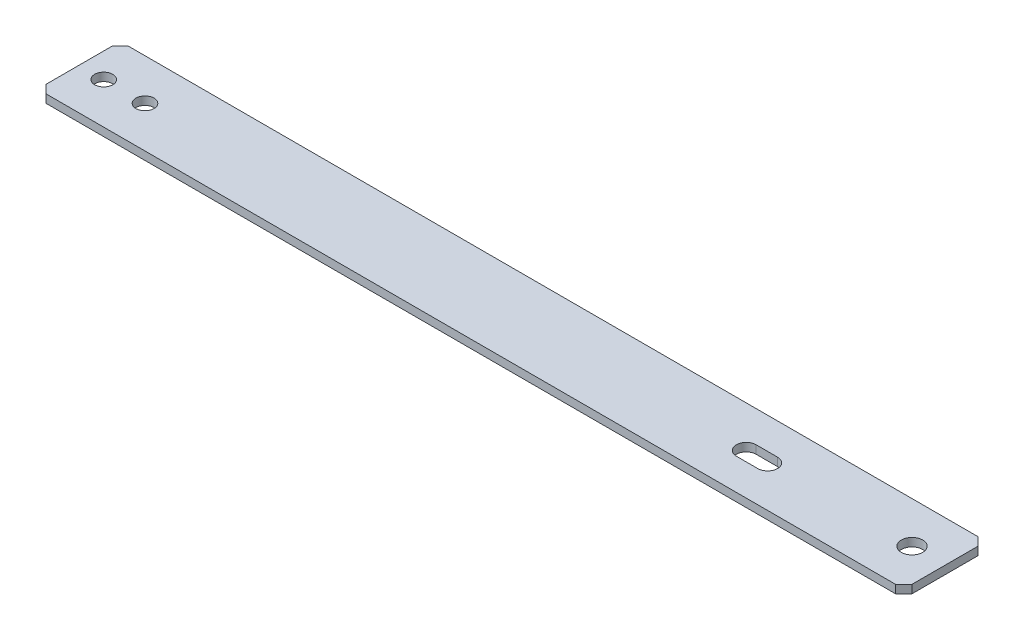
ISO-10303-21;
HEADER;
FILE_DESCRIPTION(('STEP AP214'),'2;1');
FILE_NAME('part.step','',(''),(''),'','','');
FILE_SCHEMA(('AUTOMOTIVE_DESIGN { 1 0 10303 214 1 1 1 1 }'));
ENDSEC;
DATA;
#1=APPLICATION_CONTEXT('core data for automotive mechanical design processes');
#2=APPLICATION_PROTOCOL_DEFINITION('international standard','automotive_design',2000,#1);
#3=PRODUCT_CONTEXT('',#1,'mechanical');
#4=PRODUCT('Part','Part','',(#3));
#5=PRODUCT_RELATED_PRODUCT_CATEGORY('part','',(#4));
#6=PRODUCT_DEFINITION_FORMATION('','',#4);
#7=PRODUCT_DEFINITION_CONTEXT('part definition',#1,'design');
#8=PRODUCT_DEFINITION('design','',#6,#7);
#9=PRODUCT_DEFINITION_SHAPE('','',#8);
#10=(LENGTH_UNIT() NAMED_UNIT(*) SI_UNIT(.MILLI.,.METRE.));
#11=(NAMED_UNIT(*) PLANE_ANGLE_UNIT() SI_UNIT($,.RADIAN.));
#12=(NAMED_UNIT(*) SI_UNIT($,.STERADIAN.) SOLID_ANGLE_UNIT());
#13=UNCERTAINTY_MEASURE_WITH_UNIT(LENGTH_MEASURE(1.E-05),#10,'distance_accuracy_value','');
#14=(GEOMETRIC_REPRESENTATION_CONTEXT(3) GLOBAL_UNCERTAINTY_ASSIGNED_CONTEXT((#13)) GLOBAL_UNIT_ASSIGNED_CONTEXT((#10,
#11,#12)) REPRESENTATION_CONTEXT('',''));
#15=CARTESIAN_POINT('',(0.,0.,0.));
#16=DIRECTION('',(0.,0.,1.));
#17=DIRECTION('',(1.,0.,0.));
#18=AXIS2_PLACEMENT_3D('',#15,#16,#17);
#19=CARTESIAN_POINT('',(-206.818181818182,-5.,50.));
#20=DIRECTION('',(0.,1.,0.));
#21=DIRECTION('',(0.,0.,1.));
#22=AXIS2_PLACEMENT_3D('',#19,#20,#21);
#23=PLANE('',#22);
#24=CARTESIAN_POINT('',(298.181818181818,-5.,25.));
#25=DIRECTION('',(0.,1.,0.));
#26=DIRECTION('',(0.,0.,1.));
#27=AXIS2_PLACEMENT_3D('',#24,#25,#26);
#28=CIRCLE('',#27,6.50000000000002);
#29=CARTESIAN_POINT('',(298.181818181818,-5.,31.5));
#30=VERTEX_POINT('',#29);
#31=EDGE_CURVE('E332',#30,#30,#28,.T.);
#32=ORIENTED_EDGE('',*,*,#31,.T.);
#33=EDGE_LOOP('',(#32));
#34=FACE_BOUND('',#33,.T.);
#35=DIRECTION('',(-1.,0.,0.));
#36=VECTOR('',#35,1.);
#37=CARTESIAN_POINT('',(-206.818181818182,-5.,19.0000000000001));
#38=LINE('',#37,#36);
#39=CARTESIAN_POINT('',(210.681818181818,-5.,19.));
#40=VERTEX_POINT('',#39);
#41=CARTESIAN_POINT('',(197.681818181818,-5.,19.));
#42=VERTEX_POINT('',#41);
#43=EDGE_CURVE('E170',#40,#42,#38,.T.);
#44=ORIENTED_EDGE('',*,*,#43,.T.);
#45=CARTESIAN_POINT('',(197.681818181818,-5.,25.));
#46=DIRECTION('',(0.,1.,0.));
#47=DIRECTION('',(0.,0.,1.));
#48=AXIS2_PLACEMENT_3D('',#45,#46,#47);
#49=CIRCLE('',#48,6.);
#50=CARTESIAN_POINT('',(197.681818181818,-5.,31.));
#51=VERTEX_POINT('',#50);
#52=EDGE_CURVE('E173',#42,#51,#49,.T.);
#53=ORIENTED_EDGE('',*,*,#52,.T.);
#54=DIRECTION('',(1.,0.,0.));
#55=VECTOR('',#54,1.);
#56=CARTESIAN_POINT('',(-206.818181818182,-5.,31.0000000000001));
#57=LINE('',#56,#55);
#58=CARTESIAN_POINT('',(210.681818181818,-5.,31.));
#59=VERTEX_POINT('',#58);
#60=EDGE_CURVE('E165',#51,#59,#57,.T.);
#61=ORIENTED_EDGE('',*,*,#60,.T.);
#62=CARTESIAN_POINT('',(210.681818181818,-5.,25.));
#63=DIRECTION('',(0.,1.,0.));
#64=DIRECTION('',(0.,0.,1.));
#65=AXIS2_PLACEMENT_3D('',#62,#63,#64);
#66=CIRCLE('',#65,6.);
#67=EDGE_CURVE('E140',#59,#40,#66,.T.);
#68=ORIENTED_EDGE('',*,*,#67,.T.);
#69=EDGE_LOOP('',(#44,#53,#61,#68));
#70=FACE_BOUND('',#69,.T.);
#71=CARTESIAN_POINT('',(-191.818181818182,-5.,25.));
#72=DIRECTION('',(0.,1.,0.));
#73=DIRECTION('',(0.,0.,1.));
#74=AXIS2_PLACEMENT_3D('',#71,#72,#73);
#75=CIRCLE('',#74,5.50000000000002);
#76=CARTESIAN_POINT('',(-191.818181818182,-5.,30.5));
#77=VERTEX_POINT('',#76);
#78=EDGE_CURVE('E185',#77,#77,#75,.T.);
#79=ORIENTED_EDGE('',*,*,#78,.T.);
#80=EDGE_LOOP('',(#79));
#81=FACE_BOUND('',#80,.T.);
#82=CARTESIAN_POINT('',(-166.818181818182,-5.,25.));
#83=DIRECTION('',(0.,1.,0.));
#84=DIRECTION('',(0.,0.,1.));
#85=AXIS2_PLACEMENT_3D('',#82,#83,#84);
#86=CIRCLE('',#85,5.50000000000002);
#87=CARTESIAN_POINT('',(-166.818181818182,-5.,30.5));
#88=VERTEX_POINT('',#87);
#89=EDGE_CURVE('E180',#88,#88,#86,.T.);
#90=ORIENTED_EDGE('',*,*,#89,.T.);
#91=EDGE_LOOP('',(#90));
#92=FACE_BOUND('',#91,.T.);
#93=DIRECTION('',(0.,0.,-1.));
#94=VECTOR('',#93,1.);
#95=CARTESIAN_POINT('',(-206.818181818182,-5.,50.));
#96=LINE('',#95,#94);
#97=CARTESIAN_POINT('',(-206.818181818182,-5.,45.));
#98=VERTEX_POINT('',#97);
#99=CARTESIAN_POINT('',(-206.818181818182,-5.,5.));
#100=VERTEX_POINT('',#99);
#101=EDGE_CURVE('E194',#98,#100,#96,.T.);
#102=ORIENTED_EDGE('',*,*,#101,.T.);
#103=DIRECTION('',(-0.707106781186548,0.,0.707106781186547));
#104=VECTOR('',#103,1.);
#105=CARTESIAN_POINT('',(-201.818181818182,-5.,0.));
#106=LINE('',#105,#104);
#107=CARTESIAN_POINT('',(-201.818181818182,-5.,0.));
#108=VERTEX_POINT('',#107);
#109=EDGE_CURVE('E11',#100,#108,#106,.F.);
#110=ORIENTED_EDGE('',*,*,#109,.T.);
#111=DIRECTION('',(1.,0.,0.));
#112=VECTOR('',#111,1.);
#113=CARTESIAN_POINT('',(-206.818181818182,-5.,0.));
#114=LINE('',#113,#112);
#115=CARTESIAN_POINT('',(313.181818181818,-5.,0.));
#116=VERTEX_POINT('',#115);
#117=EDGE_CURVE('E188',#108,#116,#114,.T.);
#118=ORIENTED_EDGE('',*,*,#117,.T.);
#119=DIRECTION('',(-0.707106781186548,0.,-0.707106781186547));
#120=VECTOR('',#119,1.);
#121=CARTESIAN_POINT('',(313.181818181818,-5.,0.));
#122=LINE('',#121,#120);
#123=CARTESIAN_POINT('',(318.181818181818,-5.,5.));
#124=VERTEX_POINT('',#123);
#125=EDGE_CURVE('E207',#116,#124,#122,.F.);
#126=ORIENTED_EDGE('',*,*,#125,.T.);
#127=DIRECTION('',(0.,0.,-1.));
#128=VECTOR('',#127,1.);
#129=CARTESIAN_POINT('',(318.181818181818,-5.,50.));
#130=LINE('',#129,#128);
#131=CARTESIAN_POINT('',(318.181818181818,-5.,45.));
#132=VERTEX_POINT('',#131);
#133=EDGE_CURVE('E202',#132,#124,#130,.T.);
#134=ORIENTED_EDGE('',*,*,#133,.F.);
#135=DIRECTION('',(-0.707106781186548,0.,0.707106781186547));
#136=VECTOR('',#135,1.);
#137=CARTESIAN_POINT('',(318.181818181818,-5.,45.));
#138=LINE('',#137,#136);
#139=CARTESIAN_POINT('',(313.181818181818,-5.,50.));
#140=VERTEX_POINT('',#139);
#141=EDGE_CURVE('E219',#132,#140,#138,.T.);
#142=ORIENTED_EDGE('',*,*,#141,.T.);
#143=DIRECTION('',(1.,0.,0.));
#144=VECTOR('',#143,1.);
#145=CARTESIAN_POINT('',(-206.818181818182,-5.,50.));
#146=LINE('',#145,#144);
#147=CARTESIAN_POINT('',(-201.818181818182,-5.,50.));
#148=VERTEX_POINT('',#147);
#149=EDGE_CURVE('E189',#148,#140,#146,.T.);
#150=ORIENTED_EDGE('',*,*,#149,.F.);
#151=DIRECTION('',(-0.707106781186548,0.,-0.707106781186547));
#152=VECTOR('',#151,1.);
#153=CARTESIAN_POINT('',(-206.818181818182,-5.,45.));
#154=LINE('',#153,#152);
#155=EDGE_CURVE('E234',#148,#98,#154,.T.);
#156=ORIENTED_EDGE('',*,*,#155,.T.);
#157=EDGE_LOOP('',(#102,#110,#118,#126,#134,#142,#150,#156));
#158=FACE_BOUND('',#157,.T.);
#159=ADVANCED_FACE('F43',(#34,#70,#81,#92,#158),#23,.F.);
#160=CARTESIAN_POINT('',(318.181818181818,0.,50.));
#161=DIRECTION('',(1.,0.,0.));
#162=DIRECTION('',(0.,0.,-1.));
#163=AXIS2_PLACEMENT_3D('',#160,#161,#162);
#164=PLANE('',#163);
#165=DIRECTION('',(0.,0.,-1.));
#166=VECTOR('',#165,1.);
#167=CARTESIAN_POINT('',(318.181818181818,0.,50.));
#168=LINE('',#167,#166);
#169=CARTESIAN_POINT('',(318.181818181818,0.,45.));
#170=VERTEX_POINT('',#169);
#171=CARTESIAN_POINT('',(318.181818181818,0.,5.));
#172=VERTEX_POINT('',#171);
#173=EDGE_CURVE('E200',#170,#172,#168,.T.);
#174=ORIENTED_EDGE('',*,*,#173,.F.);
#175=DIRECTION('',(0.,-1.,0.));
#176=VECTOR('',#175,1.);
#177=CARTESIAN_POINT('',(318.181818181818,-5.,45.));
#178=LINE('',#177,#176);
#179=EDGE_CURVE('E216',#170,#132,#178,.T.);
#180=ORIENTED_EDGE('',*,*,#179,.T.);
#181=ORIENTED_EDGE('',*,*,#133,.T.);
#182=DIRECTION('',(0.,1.,0.));
#183=VECTOR('',#182,1.);
#184=CARTESIAN_POINT('',(318.181818181818,0.,5.));
#185=LINE('',#184,#183);
#186=EDGE_CURVE('E210',#124,#172,#185,.T.);
#187=ORIENTED_EDGE('',*,*,#186,.T.);
#188=EDGE_LOOP('',(#174,#180,#181,#187));
#189=FACE_BOUND('',#188,.T.);
#190=ADVANCED_FACE('F263',(#189),#164,.T.);
#191=CARTESIAN_POINT('',(-206.818181818182,0.,50.));
#192=DIRECTION('',(0.,1.,0.));
#193=DIRECTION('',(0.,0.,1.));
#194=AXIS2_PLACEMENT_3D('',#191,#192,#193);
#195=PLANE('',#194);
#196=CARTESIAN_POINT('',(298.181818181818,0.,25.));
#197=DIRECTION('',(0.,1.,0.));
#198=DIRECTION('',(0.,0.,1.));
#199=AXIS2_PLACEMENT_3D('',#196,#197,#198);
#200=CIRCLE('',#199,6.50000000000002);
#201=CARTESIAN_POINT('',(298.181818181818,0.,31.5));
#202=VERTEX_POINT('',#201);
#203=EDGE_CURVE('E330',#202,#202,#200,.T.);
#204=ORIENTED_EDGE('',*,*,#203,.F.);
#205=EDGE_LOOP('',(#204));
#206=FACE_BOUND('',#205,.T.);
#207=CARTESIAN_POINT('',(197.681818181818,0.,25.));
#208=DIRECTION('',(0.,1.,0.));
#209=DIRECTION('',(0.,0.,1.));
#210=AXIS2_PLACEMENT_3D('',#207,#208,#209);
#211=CIRCLE('',#210,6.);
#212=CARTESIAN_POINT('',(197.681818181818,0.,19.));
#213=VERTEX_POINT('',#212);
#214=CARTESIAN_POINT('',(197.681818181818,0.,31.));
#215=VERTEX_POINT('',#214);
#216=EDGE_CURVE('E153',#213,#215,#211,.T.);
#217=ORIENTED_EDGE('',*,*,#216,.F.);
#218=DIRECTION('',(-1.,0.,0.));
#219=VECTOR('',#218,1.);
#220=CARTESIAN_POINT('',(197.681818181818,0.,19.));
#221=LINE('',#220,#219);
#222=CARTESIAN_POINT('',(210.681818181818,0.,19.));
#223=VERTEX_POINT('',#222);
#224=EDGE_CURVE('E158',#223,#213,#221,.T.);
#225=ORIENTED_EDGE('',*,*,#224,.F.);
#226=CARTESIAN_POINT('',(210.681818181818,0.,25.));
#227=DIRECTION('',(0.,1.,0.));
#228=DIRECTION('',(0.,0.,1.));
#229=AXIS2_PLACEMENT_3D('',#226,#227,#228);
#230=CIRCLE('',#229,6.);
#231=CARTESIAN_POINT('',(210.681818181818,0.,31.));
#232=VERTEX_POINT('',#231);
#233=EDGE_CURVE('E137',#232,#223,#230,.T.);
#234=ORIENTED_EDGE('',*,*,#233,.F.);
#235=DIRECTION('',(1.,0.,0.));
#236=VECTOR('',#235,1.);
#237=CARTESIAN_POINT('',(197.681818181818,0.,31.));
#238=LINE('',#237,#236);
#239=EDGE_CURVE('E148',#215,#232,#238,.T.);
#240=ORIENTED_EDGE('',*,*,#239,.F.);
#241=EDGE_LOOP('',(#217,#225,#234,#240));
#242=FACE_BOUND('',#241,.T.);
#243=CARTESIAN_POINT('',(-191.818181818182,0.,25.));
#244=DIRECTION('',(0.,1.,0.));
#245=DIRECTION('',(0.,0.,1.));
#246=AXIS2_PLACEMENT_3D('',#243,#244,#245);
#247=CIRCLE('',#246,5.50000000000002);
#248=CARTESIAN_POINT('',(-191.818181818182,0.,30.5));
#249=VERTEX_POINT('',#248);
#250=EDGE_CURVE('E177',#249,#249,#247,.T.);
#251=ORIENTED_EDGE('',*,*,#250,.F.);
#252=EDGE_LOOP('',(#251));
#253=FACE_BOUND('',#252,.T.);
#254=CARTESIAN_POINT('',(-166.818181818182,0.,25.));
#255=DIRECTION('',(0.,1.,0.));
#256=DIRECTION('',(0.,0.,1.));
#257=AXIS2_PLACEMENT_3D('',#254,#255,#256);
#258=CIRCLE('',#257,5.50000000000002);
#259=CARTESIAN_POINT('',(-166.818181818182,0.,30.5));
#260=VERTEX_POINT('',#259);
#261=EDGE_CURVE('E176',#260,#260,#258,.T.);
#262=ORIENTED_EDGE('',*,*,#261,.F.);
#263=EDGE_LOOP('',(#262));
#264=FACE_BOUND('',#263,.T.);
#265=DIRECTION('',(1.,0.,0.));
#266=VECTOR('',#265,1.);
#267=CARTESIAN_POINT('',(-206.818181818182,0.,0.));
#268=LINE('',#267,#266);
#269=CARTESIAN_POINT('',(-201.818181818182,0.,0.));
#270=VERTEX_POINT('',#269);
#271=CARTESIAN_POINT('',(313.181818181818,0.,0.));
#272=VERTEX_POINT('',#271);
#273=EDGE_CURVE('E192',#270,#272,#268,.T.);
#274=ORIENTED_EDGE('',*,*,#273,.F.);
#275=DIRECTION('',(0.707106781186548,0.,-0.707106781186547));
#276=VECTOR('',#275,1.);
#277=CARTESIAN_POINT('',(-229.318181818182,0.,27.5));
#278=LINE('',#277,#276);
#279=CARTESIAN_POINT('',(-206.818181818182,0.,5.));
#280=VERTEX_POINT('',#279);
#281=EDGE_CURVE('E65',#270,#280,#278,.F.);
#282=ORIENTED_EDGE('',*,*,#281,.T.);
#283=DIRECTION('',(0.,0.,-1.));
#284=VECTOR('',#283,1.);
#285=CARTESIAN_POINT('',(-206.818181818182,0.,50.));
#286=LINE('',#285,#284);
#287=CARTESIAN_POINT('',(-206.818181818182,0.,45.));
#288=VERTEX_POINT('',#287);
#289=EDGE_CURVE('E198',#288,#280,#286,.T.);
#290=ORIENTED_EDGE('',*,*,#289,.F.);
#291=DIRECTION('',(0.707106781186548,0.,0.707106781186547));
#292=VECTOR('',#291,1.);
#293=CARTESIAN_POINT('',(-204.318181818182,0.,47.5));
#294=LINE('',#293,#292);
#295=CARTESIAN_POINT('',(-201.818181818182,0.,50.));
#296=VERTEX_POINT('',#295);
#297=EDGE_CURVE('E230',#288,#296,#294,.T.);
#298=ORIENTED_EDGE('',*,*,#297,.T.);
#299=DIRECTION('',(1.,0.,0.));
#300=VECTOR('',#299,1.);
#301=CARTESIAN_POINT('',(-206.818181818182,0.,50.));
#302=LINE('',#301,#300);
#303=CARTESIAN_POINT('',(313.181818181818,0.,50.));
#304=VERTEX_POINT('',#303);
#305=EDGE_CURVE('E191',#296,#304,#302,.T.);
#306=ORIENTED_EDGE('',*,*,#305,.T.);
#307=DIRECTION('',(0.707106781186548,0.,-0.707106781186547));
#308=VECTOR('',#307,1.);
#309=CARTESIAN_POINT('',(53.1818181818177,0.,310.));
#310=LINE('',#309,#308);
#311=EDGE_CURVE('E225',#304,#170,#310,.T.);
#312=ORIENTED_EDGE('',*,*,#311,.T.);
#313=ORIENTED_EDGE('',*,*,#173,.T.);
#314=DIRECTION('',(0.707106781186548,0.,0.707106781186547));
#315=VECTOR('',#314,1.);
#316=CARTESIAN_POINT('',(78.1818181818177,0.,-235.));
#317=LINE('',#316,#315);
#318=EDGE_CURVE('E213',#172,#272,#317,.F.);
#319=ORIENTED_EDGE('',*,*,#318,.T.);
#320=EDGE_LOOP('',(#274,#282,#290,#298,#306,#312,#313,#319));
#321=FACE_BOUND('',#320,.T.);
#322=ADVANCED_FACE('F155',(#206,#242,#253,#264,#321),#195,.T.);
#323=CARTESIAN_POINT('',(-206.818181818182,-5.,50.));
#324=DIRECTION('',(-1.,0.,0.));
#325=DIRECTION('',(0.,0.,1.));
#326=AXIS2_PLACEMENT_3D('',#323,#324,#325);
#327=PLANE('',#326);
#328=ORIENTED_EDGE('',*,*,#289,.T.);
#329=DIRECTION('',(0.,-1.,0.));
#330=VECTOR('',#329,1.);
#331=CARTESIAN_POINT('',(-206.818181818182,-5.,5.));
#332=LINE('',#331,#330);
#333=EDGE_CURVE('E51',#280,#100,#332,.T.);
#334=ORIENTED_EDGE('',*,*,#333,.T.);
#335=ORIENTED_EDGE('',*,*,#101,.F.);
#336=DIRECTION('',(0.,1.,0.));
#337=VECTOR('',#336,1.);
#338=CARTESIAN_POINT('',(-206.818181818182,0.,45.));
#339=LINE('',#338,#337);
#340=EDGE_CURVE('E227',#98,#288,#339,.T.);
#341=ORIENTED_EDGE('',*,*,#340,.T.);
#342=EDGE_LOOP('',(#328,#334,#335,#341));
#343=FACE_BOUND('',#342,.T.);
#344=ADVANCED_FACE('F292',(#343),#327,.T.);
#345=CARTESIAN_POINT('',(0.,0.,50.));
#346=DIRECTION('',(0.,0.,-1.));
#347=DIRECTION('',(-1.,0.,0.));
#348=AXIS2_PLACEMENT_3D('',#345,#346,#347);
#349=PLANE('',#348);
#350=ORIENTED_EDGE('',*,*,#305,.F.);
#351=DIRECTION('',(0.,-1.,0.));
#352=VECTOR('',#351,1.);
#353=CARTESIAN_POINT('',(-201.818181818182,-5.,50.));
#354=LINE('',#353,#352);
#355=EDGE_CURVE('E232',#296,#148,#354,.T.);
#356=ORIENTED_EDGE('',*,*,#355,.T.);
#357=ORIENTED_EDGE('',*,*,#149,.T.);
#358=DIRECTION('',(0.,1.,0.));
#359=VECTOR('',#358,1.);
#360=CARTESIAN_POINT('',(313.181818181818,0.,50.));
#361=LINE('',#360,#359);
#362=EDGE_CURVE('E222',#140,#304,#361,.T.);
#363=ORIENTED_EDGE('',*,*,#362,.T.);
#364=EDGE_LOOP('',(#350,#356,#357,#363));
#365=FACE_BOUND('',#364,.T.);
#366=ADVANCED_FACE('F288',(#365),#349,.F.);
#367=CARTESIAN_POINT('',(0.,0.,0.));
#368=DIRECTION('',(0.,0.,-1.));
#369=DIRECTION('',(-1.,0.,0.));
#370=AXIS2_PLACEMENT_3D('',#367,#368,#369);
#371=PLANE('',#370);
#372=ORIENTED_EDGE('',*,*,#117,.F.);
#373=DIRECTION('',(0.,1.,0.));
#374=VECTOR('',#373,1.);
#375=CARTESIAN_POINT('',(-201.818181818182,0.,0.));
#376=LINE('',#375,#374);
#377=EDGE_CURVE('E236',#108,#270,#376,.T.);
#378=ORIENTED_EDGE('',*,*,#377,.T.);
#379=ORIENTED_EDGE('',*,*,#273,.T.);
#380=DIRECTION('',(0.,-1.,0.));
#381=VECTOR('',#380,1.);
#382=CARTESIAN_POINT('',(313.181818181818,0.,0.));
#383=LINE('',#382,#381);
#384=EDGE_CURVE('E204',#272,#116,#383,.T.);
#385=ORIENTED_EDGE('',*,*,#384,.T.);
#386=EDGE_LOOP('',(#372,#378,#379,#385));
#387=FACE_BOUND('',#386,.T.);
#388=ADVANCED_FACE('F242',(#387),#371,.T.);
#389=CARTESIAN_POINT('',(-166.818181818182,-10.,25.));
#390=DIRECTION('',(0.,1.,0.));
#391=DIRECTION('',(0.,0.,1.));
#392=AXIS2_PLACEMENT_3D('',#389,#390,#391);
#393=CYLINDRICAL_SURFACE('',#392,5.50000000000002);
#394=ORIENTED_EDGE('',*,*,#261,.T.);
#395=EDGE_LOOP('',(#394));
#396=FACE_BOUND('',#395,.T.);
#397=ORIENTED_EDGE('',*,*,#89,.F.);
#398=EDGE_LOOP('',(#397));
#399=FACE_BOUND('',#398,.T.);
#400=ADVANCED_FACE('F303',(#396,#399),#393,.F.);
#401=CARTESIAN_POINT('',(-191.818181818182,-10.,25.));
#402=DIRECTION('',(0.,1.,0.));
#403=DIRECTION('',(0.,0.,1.));
#404=AXIS2_PLACEMENT_3D('',#401,#402,#403);
#405=CYLINDRICAL_SURFACE('',#404,5.50000000000002);
#406=ORIENTED_EDGE('',*,*,#250,.T.);
#407=EDGE_LOOP('',(#406));
#408=FACE_BOUND('',#407,.T.);
#409=ORIENTED_EDGE('',*,*,#78,.F.);
#410=EDGE_LOOP('',(#409));
#411=FACE_BOUND('',#410,.T.);
#412=ADVANCED_FACE('F307',(#408,#411),#405,.F.);
#413=CARTESIAN_POINT('',(197.681818181818,-10.,25.));
#414=DIRECTION('',(0.,1.,0.));
#415=DIRECTION('',(0.,0.,1.));
#416=AXIS2_PLACEMENT_3D('',#413,#414,#415);
#417=CYLINDRICAL_SURFACE('',#416,6.);
#418=DIRECTION('',(0.,1.,0.));
#419=VECTOR('',#418,1.);
#420=CARTESIAN_POINT('',(197.681818181818,-10.,19.));
#421=LINE('',#420,#419);
#422=EDGE_CURVE('E163',#42,#213,#421,.T.);
#423=ORIENTED_EDGE('',*,*,#422,.T.);
#424=ORIENTED_EDGE('',*,*,#216,.T.);
#425=DIRECTION('',(0.,1.,0.));
#426=VECTOR('',#425,1.);
#427=CARTESIAN_POINT('',(197.681818181818,-10.,31.));
#428=LINE('',#427,#426);
#429=EDGE_CURVE('E144',#51,#215,#428,.T.);
#430=ORIENTED_EDGE('',*,*,#429,.F.);
#431=ORIENTED_EDGE('',*,*,#52,.F.);
#432=EDGE_LOOP('',(#423,#424,#430,#431));
#433=FACE_BOUND('',#432,.T.);
#434=ADVANCED_FACE('F311',(#433),#417,.F.);
#435=CARTESIAN_POINT('',(197.681818181818,-10.,19.));
#436=DIRECTION('',(0.,0.,-1.));
#437=DIRECTION('',(-1.,0.,0.));
#438=AXIS2_PLACEMENT_3D('',#435,#436,#437);
#439=PLANE('',#438);
#440=DIRECTION('',(0.,1.,0.));
#441=VECTOR('',#440,1.);
#442=CARTESIAN_POINT('',(210.681818181818,-10.,19.));
#443=LINE('',#442,#441);
#444=EDGE_CURVE('E143',#40,#223,#443,.T.);
#445=ORIENTED_EDGE('',*,*,#444,.T.);
#446=ORIENTED_EDGE('',*,*,#224,.T.);
#447=ORIENTED_EDGE('',*,*,#422,.F.);
#448=ORIENTED_EDGE('',*,*,#43,.F.);
#449=EDGE_LOOP('',(#445,#446,#447,#448));
#450=FACE_BOUND('',#449,.T.);
#451=ADVANCED_FACE('F314',(#450),#439,.F.);
#452=CARTESIAN_POINT('',(210.681818181818,-10.,25.));
#453=DIRECTION('',(0.,1.,0.));
#454=DIRECTION('',(0.,0.,1.));
#455=AXIS2_PLACEMENT_3D('',#452,#453,#454);
#456=CYLINDRICAL_SURFACE('',#455,6.);
#457=DIRECTION('',(0.,1.,0.));
#458=VECTOR('',#457,1.);
#459=CARTESIAN_POINT('',(210.681818181818,-10.,31.));
#460=LINE('',#459,#458);
#461=EDGE_CURVE('E132',#59,#232,#460,.T.);
#462=ORIENTED_EDGE('',*,*,#461,.T.);
#463=ORIENTED_EDGE('',*,*,#233,.T.);
#464=ORIENTED_EDGE('',*,*,#444,.F.);
#465=ORIENTED_EDGE('',*,*,#67,.F.);
#466=EDGE_LOOP('',(#462,#463,#464,#465));
#467=FACE_BOUND('',#466,.T.);
#468=ADVANCED_FACE('F134',(#467),#456,.F.);
#469=CARTESIAN_POINT('',(197.681818181818,-10.,31.));
#470=DIRECTION('',(0.,0.,1.));
#471=DIRECTION('',(1.,0.,0.));
#472=AXIS2_PLACEMENT_3D('',#469,#470,#471);
#473=PLANE('',#472);
#474=ORIENTED_EDGE('',*,*,#429,.T.);
#475=ORIENTED_EDGE('',*,*,#239,.T.);
#476=ORIENTED_EDGE('',*,*,#461,.F.);
#477=ORIENTED_EDGE('',*,*,#60,.F.);
#478=EDGE_LOOP('',(#474,#475,#476,#477));
#479=FACE_BOUND('',#478,.T.);
#480=ADVANCED_FACE('F149',(#479),#473,.F.);
#481=CARTESIAN_POINT('',(298.181818181818,-10.,25.));
#482=DIRECTION('',(0.,1.,0.));
#483=DIRECTION('',(0.,0.,1.));
#484=AXIS2_PLACEMENT_3D('',#481,#482,#483);
#485=CYLINDRICAL_SURFACE('',#484,6.50000000000002);
#486=ORIENTED_EDGE('',*,*,#203,.T.);
#487=EDGE_LOOP('',(#486));
#488=FACE_BOUND('',#487,.T.);
#489=ORIENTED_EDGE('',*,*,#31,.F.);
#490=EDGE_LOOP('',(#489));
#491=FACE_BOUND('',#490,.T.);
#492=ADVANCED_FACE('F277',(#488,#491),#485,.F.);
#493=CARTESIAN_POINT('',(313.181818181818,0.,0.));
#494=DIRECTION('',(-0.707106781186547,0.,0.707106781186548));
#495=DIRECTION('',(0.,-1.,0.));
#496=AXIS2_PLACEMENT_3D('',#493,#494,#495);
#497=PLANE('',#496);
#498=ORIENTED_EDGE('',*,*,#318,.F.);
#499=ORIENTED_EDGE('',*,*,#186,.F.);
#500=ORIENTED_EDGE('',*,*,#125,.F.);
#501=ORIENTED_EDGE('',*,*,#384,.F.);
#502=EDGE_LOOP('',(#498,#499,#500,#501));
#503=FACE_BOUND('',#502,.T.);
#504=ADVANCED_FACE('F251',(#503),#497,.F.);
#505=CARTESIAN_POINT('',(318.181818181818,0.,45.));
#506=DIRECTION('',(0.707106781186547,0.,0.707106781186548));
#507=DIRECTION('',(0.,1.,0.));
#508=AXIS2_PLACEMENT_3D('',#505,#506,#507);
#509=PLANE('',#508);
#510=ORIENTED_EDGE('',*,*,#311,.F.);
#511=ORIENTED_EDGE('',*,*,#362,.F.);
#512=ORIENTED_EDGE('',*,*,#141,.F.);
#513=ORIENTED_EDGE('',*,*,#179,.F.);
#514=EDGE_LOOP('',(#510,#511,#512,#513));
#515=FACE_BOUND('',#514,.T.);
#516=ADVANCED_FACE('F260',(#515),#509,.T.);
#517=CARTESIAN_POINT('',(-206.818181818182,-5.,45.));
#518=DIRECTION('',(-0.707106781186547,0.,0.707106781186548));
#519=DIRECTION('',(0.,-1.,0.));
#520=AXIS2_PLACEMENT_3D('',#517,#518,#519);
#521=PLANE('',#520);
#522=ORIENTED_EDGE('',*,*,#155,.F.);
#523=ORIENTED_EDGE('',*,*,#355,.F.);
#524=ORIENTED_EDGE('',*,*,#297,.F.);
#525=ORIENTED_EDGE('',*,*,#340,.F.);
#526=EDGE_LOOP('',(#522,#523,#524,#525));
#527=FACE_BOUND('',#526,.T.);
#528=ADVANCED_FACE('F255',(#527),#521,.T.);
#529=CARTESIAN_POINT('',(-201.818181818182,0.,0.));
#530=DIRECTION('',(0.707106781186547,0.,0.707106781186548));
#531=DIRECTION('',(0.,1.,0.));
#532=AXIS2_PLACEMENT_3D('',#529,#530,#531);
#533=PLANE('',#532);
#534=ORIENTED_EDGE('',*,*,#109,.F.);
#535=ORIENTED_EDGE('',*,*,#333,.F.);
#536=ORIENTED_EDGE('',*,*,#281,.F.);
#537=ORIENTED_EDGE('',*,*,#377,.F.);
#538=EDGE_LOOP('',(#534,#535,#536,#537));
#539=FACE_BOUND('',#538,.T.);
#540=ADVANCED_FACE('F45',(#539),#533,.F.);
#541=CLOSED_SHELL('',(#159,#190,#322,#344,#366,#388,#400,#412,#434,#451,#468,#480,#492,#504,
#516,#528,#540));
#542=MANIFOLD_SOLID_BREP('B2',#541);
#543=ADVANCED_BREP_SHAPE_REPRESENTATION('',(#18,#542),#14);
#544=SHAPE_DEFINITION_REPRESENTATION(#9,#543);
ENDSEC;
END-ISO-10303-21;
